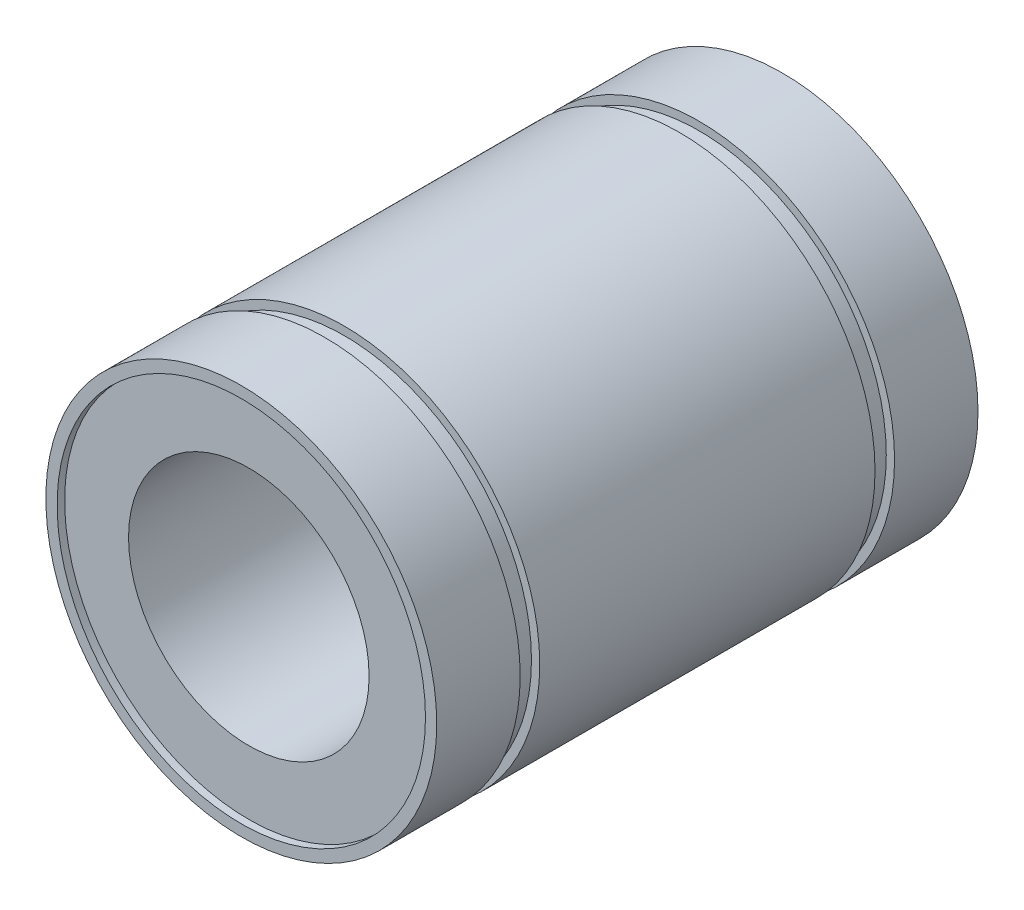
ISO-10303-21;
HEADER;
FILE_DESCRIPTION(('STEP AP214'),'2;1');
FILE_NAME('part.step','',(''),(''),'','','');
FILE_SCHEMA(('AUTOMOTIVE_DESIGN { 1 0 10303 214 1 1 1 1 }'));
ENDSEC;
DATA;
#1=APPLICATION_CONTEXT('core data for automotive mechanical design processes');
#2=APPLICATION_PROTOCOL_DEFINITION('international standard','automotive_design',2000,#1);
#3=PRODUCT_CONTEXT('',#1,'mechanical');
#4=PRODUCT('Part','Part','',(#3));
#5=PRODUCT_RELATED_PRODUCT_CATEGORY('part','',(#4));
#6=PRODUCT_DEFINITION_FORMATION('','',#4);
#7=PRODUCT_DEFINITION_CONTEXT('part definition',#1,'design');
#8=PRODUCT_DEFINITION('design','',#6,#7);
#9=PRODUCT_DEFINITION_SHAPE('','',#8);
#10=(LENGTH_UNIT() NAMED_UNIT(*) SI_UNIT(.MILLI.,.METRE.));
#11=(NAMED_UNIT(*) PLANE_ANGLE_UNIT() SI_UNIT($,.RADIAN.));
#12=(NAMED_UNIT(*) SI_UNIT($,.STERADIAN.) SOLID_ANGLE_UNIT());
#13=UNCERTAINTY_MEASURE_WITH_UNIT(LENGTH_MEASURE(1.E-05),#10,'distance_accuracy_value','');
#14=(GEOMETRIC_REPRESENTATION_CONTEXT(3) GLOBAL_UNCERTAINTY_ASSIGNED_CONTEXT((#13)) GLOBAL_UNIT_ASSIGNED_CONTEXT((#10,
#11,#12)) REPRESENTATION_CONTEXT('',''));
#15=CARTESIAN_POINT('',(0.,0.,0.));
#16=DIRECTION('',(0.,0.,1.));
#17=DIRECTION('',(1.,0.,0.));
#18=AXIS2_PLACEMENT_3D('',#15,#16,#17);
#19=CARTESIAN_POINT('',(0.,0.,18.));
#20=DIRECTION('',(0.,0.,1.));
#21=DIRECTION('',(1.,0.,0.));
#22=AXIS2_PLACEMENT_3D('',#19,#20,#21);
#23=CYLINDRICAL_SURFACE('',#22,8.);
#24=CARTESIAN_POINT('',(0.,0.,35.5));
#25=DIRECTION('',(0.,0.,1.));
#26=DIRECTION('',(1.,0.,0.));
#27=AXIS2_PLACEMENT_3D('',#24,#25,#26);
#28=CIRCLE('',#27,8.);
#29=CARTESIAN_POINT('',(8.,0.,35.5));
#30=VERTEX_POINT('',#29);
#31=EDGE_CURVE('E17',#30,#30,#28,.T.);
#32=ORIENTED_EDGE('',*,*,#31,.T.);
#33=EDGE_LOOP('',(#32));
#34=FACE_BOUND('',#33,.T.);
#35=CARTESIAN_POINT('',(0.,0.,0.5));
#36=DIRECTION('',(0.,0.,1.));
#37=DIRECTION('',(1.,0.,0.));
#38=AXIS2_PLACEMENT_3D('',#35,#36,#37);
#39=CIRCLE('',#38,8.);
#40=CARTESIAN_POINT('',(8.,0.,0.5));
#41=VERTEX_POINT('',#40);
#42=EDGE_CURVE('E63',#41,#41,#39,.T.);
#43=ORIENTED_EDGE('',*,*,#42,.F.);
#44=EDGE_LOOP('',(#43));
#45=FACE_BOUND('',#44,.T.);
#46=ADVANCED_FACE('F14',(#34,#45),#23,.F.);
#47=CARTESIAN_POINT('',(0.,0.,35.5));
#48=DIRECTION('',(0.,0.,-1.));
#49=DIRECTION('',(-1.,0.,0.));
#50=AXIS2_PLACEMENT_3D('',#47,#48,#49);
#51=PLANE('',#50);
#52=ORIENTED_EDGE('',*,*,#31,.F.);
#53=EDGE_LOOP('',(#52));
#54=FACE_BOUND('',#53,.T.);
#55=CARTESIAN_POINT('',(0.,0.,35.5));
#56=DIRECTION('',(0.,0.,1.));
#57=DIRECTION('',(1.,0.,0.));
#58=AXIS2_PLACEMENT_3D('',#55,#56,#57);
#59=CIRCLE('',#58,12.25);
#60=CARTESIAN_POINT('',(12.25,0.,35.5));
#61=VERTEX_POINT('',#60);
#62=EDGE_CURVE('E61',#61,#61,#59,.T.);
#63=ORIENTED_EDGE('',*,*,#62,.T.);
#64=EDGE_LOOP('',(#63));
#65=FACE_BOUND('',#64,.T.);
#66=ADVANCED_FACE('F72',(#54,#65),#51,.F.);
#67=CARTESIAN_POINT('',(0.,0.,0.5));
#68=DIRECTION('',(0.,0.,-1.));
#69=DIRECTION('',(-1.,0.,0.));
#70=AXIS2_PLACEMENT_3D('',#67,#68,#69);
#71=PLANE('',#70);
#72=ORIENTED_EDGE('',*,*,#42,.T.);
#73=EDGE_LOOP('',(#72));
#74=FACE_BOUND('',#73,.T.);
#75=CARTESIAN_POINT('',(0.,0.,0.5));
#76=DIRECTION('',(0.,0.,1.));
#77=DIRECTION('',(1.,0.,0.));
#78=AXIS2_PLACEMENT_3D('',#75,#76,#77);
#79=CIRCLE('',#78,12.25);
#80=CARTESIAN_POINT('',(12.25,0.,0.5));
#81=VERTEX_POINT('',#80);
#82=EDGE_CURVE('E58',#81,#81,#79,.F.);
#83=ORIENTED_EDGE('',*,*,#82,.T.);
#84=EDGE_LOOP('',(#83));
#85=FACE_BOUND('',#84,.T.);
#86=ADVANCED_FACE('F75',(#74,#85),#71,.T.);
#87=CARTESIAN_POINT('',(0.,0.,0.));
#88=DIRECTION('',(0.,0.,1.));
#89=DIRECTION('',(1.,0.,0.));
#90=AXIS2_PLACEMENT_3D('',#87,#88,#89);
#91=CYLINDRICAL_SURFACE('',#90,12.25);
#92=CARTESIAN_POINT('',(0.,0.,36.));
#93=DIRECTION('',(0.,0.,1.));
#94=DIRECTION('',(1.,0.,0.));
#95=AXIS2_PLACEMENT_3D('',#92,#93,#94);
#96=CIRCLE('',#95,12.25);
#97=CARTESIAN_POINT('',(12.25,0.,36.));
#98=VERTEX_POINT('',#97);
#99=EDGE_CURVE('E55',#98,#98,#96,.T.);
#100=ORIENTED_EDGE('',*,*,#99,.T.);
#101=EDGE_LOOP('',(#100));
#102=FACE_BOUND('',#101,.T.);
#103=ORIENTED_EDGE('',*,*,#62,.F.);
#104=EDGE_LOOP('',(#103));
#105=FACE_BOUND('',#104,.T.);
#106=ADVANCED_FACE('F78',(#102,#105),#91,.F.);
#107=CARTESIAN_POINT('',(0.,0.,0.));
#108=DIRECTION('',(0.,0.,1.));
#109=DIRECTION('',(1.,0.,0.));
#110=AXIS2_PLACEMENT_3D('',#107,#108,#109);
#111=CYLINDRICAL_SURFACE('',#110,12.25);
#112=ORIENTED_EDGE('',*,*,#82,.F.);
#113=EDGE_LOOP('',(#112));
#114=FACE_BOUND('',#113,.T.);
#115=CARTESIAN_POINT('',(0.,0.,0.));
#116=DIRECTION('',(0.,0.,1.));
#117=DIRECTION('',(1.,0.,0.));
#118=AXIS2_PLACEMENT_3D('',#115,#116,#117);
#119=CIRCLE('',#118,12.25);
#120=CARTESIAN_POINT('',(12.25,0.,0.));
#121=VERTEX_POINT('',#120);
#122=EDGE_CURVE('E52',#121,#121,#119,.T.);
#123=ORIENTED_EDGE('',*,*,#122,.F.);
#124=EDGE_LOOP('',(#123));
#125=FACE_BOUND('',#124,.T.);
#126=ADVANCED_FACE('F80',(#114,#125),#111,.F.);
#127=CARTESIAN_POINT('',(0.,0.,36.));
#128=DIRECTION('',(0.,0.,-1.));
#129=DIRECTION('',(-1.,0.,0.));
#130=AXIS2_PLACEMENT_3D('',#127,#128,#129);
#131=PLANE('',#130);
#132=ORIENTED_EDGE('',*,*,#99,.F.);
#133=EDGE_LOOP('',(#132));
#134=FACE_BOUND('',#133,.T.);
#135=CARTESIAN_POINT('',(0.,0.,36.));
#136=DIRECTION('',(0.,0.,1.));
#137=DIRECTION('',(1.,0.,0.));
#138=AXIS2_PLACEMENT_3D('',#135,#136,#137);
#139=CIRCLE('',#138,13.);
#140=CARTESIAN_POINT('',(13.,0.,36.));
#141=VERTEX_POINT('',#140);
#142=EDGE_CURVE('E49',#141,#141,#139,.F.);
#143=ORIENTED_EDGE('',*,*,#142,.F.);
#144=EDGE_LOOP('',(#143));
#145=FACE_BOUND('',#144,.T.);
#146=ADVANCED_FACE('F88',(#134,#145),#131,.F.);
#147=CARTESIAN_POINT('',(0.,0.,0.));
#148=DIRECTION('',(0.,0.,-1.));
#149=DIRECTION('',(-1.,0.,0.));
#150=AXIS2_PLACEMENT_3D('',#147,#148,#149);
#151=PLANE('',#150);
#152=ORIENTED_EDGE('',*,*,#122,.T.);
#153=EDGE_LOOP('',(#152));
#154=FACE_BOUND('',#153,.T.);
#155=CARTESIAN_POINT('',(0.,0.,0.));
#156=DIRECTION('',(0.,0.,1.));
#157=DIRECTION('',(1.,0.,0.));
#158=AXIS2_PLACEMENT_3D('',#155,#156,#157);
#159=CIRCLE('',#158,13.);
#160=CARTESIAN_POINT('',(13.,0.,0.));
#161=VERTEX_POINT('',#160);
#162=EDGE_CURVE('E46',#161,#161,#159,.T.);
#163=ORIENTED_EDGE('',*,*,#162,.F.);
#164=EDGE_LOOP('',(#163));
#165=FACE_BOUND('',#164,.T.);
#166=ADVANCED_FACE('F130',(#154,#165),#151,.T.);
#167=CARTESIAN_POINT('',(0.,0.,0.));
#168=DIRECTION('',(0.,0.,1.));
#169=DIRECTION('',(1.,0.,0.));
#170=AXIS2_PLACEMENT_3D('',#167,#168,#169);
#171=CYLINDRICAL_SURFACE('',#170,13.);
#172=CARTESIAN_POINT('',(0.,0.,30.45));
#173=DIRECTION('',(0.,0.,1.));
#174=DIRECTION('',(1.,0.,0.));
#175=AXIS2_PLACEMENT_3D('',#172,#173,#174);
#176=CIRCLE('',#175,13.);
#177=CARTESIAN_POINT('',(13.,0.,30.45));
#178=VERTEX_POINT('',#177);
#179=EDGE_CURVE('E43',#178,#178,#176,.T.);
#180=ORIENTED_EDGE('',*,*,#179,.T.);
#181=EDGE_LOOP('',(#180));
#182=FACE_BOUND('',#181,.T.);
#183=ORIENTED_EDGE('',*,*,#142,.T.);
#184=EDGE_LOOP('',(#183));
#185=FACE_BOUND('',#184,.T.);
#186=ADVANCED_FACE('F126',(#182,#185),#171,.T.);
#187=CARTESIAN_POINT('',(0.,0.,0.));
#188=DIRECTION('',(0.,0.,1.));
#189=DIRECTION('',(1.,0.,0.));
#190=AXIS2_PLACEMENT_3D('',#187,#188,#189);
#191=CYLINDRICAL_SURFACE('',#190,13.);
#192=ORIENTED_EDGE('',*,*,#162,.T.);
#193=EDGE_LOOP('',(#192));
#194=FACE_BOUND('',#193,.T.);
#195=CARTESIAN_POINT('',(0.,0.,5.55));
#196=DIRECTION('',(0.,0.,1.));
#197=DIRECTION('',(1.,0.,0.));
#198=AXIS2_PLACEMENT_3D('',#195,#196,#197);
#199=CIRCLE('',#198,13.);
#200=CARTESIAN_POINT('',(13.,0.,5.55));
#201=VERTEX_POINT('',#200);
#202=EDGE_CURVE('E40',#201,#201,#199,.F.);
#203=ORIENTED_EDGE('',*,*,#202,.T.);
#204=EDGE_LOOP('',(#203));
#205=FACE_BOUND('',#204,.T.);
#206=ADVANCED_FACE('F122',(#194,#205),#191,.T.);
#207=CARTESIAN_POINT('',(12.725,0.,30.45));
#208=DIRECTION('',(0.,0.,1.));
#209=DIRECTION('',(1.,0.,0.));
#210=AXIS2_PLACEMENT_3D('',#207,#208,#209);
#211=PLANE('',#210);
#212=CARTESIAN_POINT('',(0.,0.,30.45));
#213=DIRECTION('',(0.,0.,-1.));
#214=DIRECTION('',(-1.,0.,0.));
#215=AXIS2_PLACEMENT_3D('',#212,#213,#214);
#216=CIRCLE('',#215,12.45);
#217=CARTESIAN_POINT('',(-12.45,0.,30.45));
#218=VERTEX_POINT('',#217);
#219=EDGE_CURVE('E37',#218,#218,#216,.T.);
#220=ORIENTED_EDGE('',*,*,#219,.F.);
#221=EDGE_LOOP('',(#220));
#222=FACE_BOUND('',#221,.T.);
#223=ORIENTED_EDGE('',*,*,#179,.F.);
#224=EDGE_LOOP('',(#223));
#225=FACE_BOUND('',#224,.T.);
#226=ADVANCED_FACE('F118',(#222,#225),#211,.F.);
#227=CARTESIAN_POINT('',(12.725,0.,5.55));
#228=DIRECTION('',(0.,0.,-1.));
#229=DIRECTION('',(-1.,0.,0.));
#230=AXIS2_PLACEMENT_3D('',#227,#228,#229);
#231=PLANE('',#230);
#232=CARTESIAN_POINT('',(0.,0.,5.55));
#233=DIRECTION('',(0.,0.,-1.));
#234=DIRECTION('',(-1.,0.,0.));
#235=AXIS2_PLACEMENT_3D('',#232,#233,#234);
#236=CIRCLE('',#235,12.45);
#237=CARTESIAN_POINT('',(-12.45,0.,5.55));
#238=VERTEX_POINT('',#237);
#239=EDGE_CURVE('E34',#238,#238,#236,.F.);
#240=ORIENTED_EDGE('',*,*,#239,.F.);
#241=EDGE_LOOP('',(#240));
#242=FACE_BOUND('',#241,.T.);
#243=ORIENTED_EDGE('',*,*,#202,.F.);
#244=EDGE_LOOP('',(#243));
#245=FACE_BOUND('',#244,.T.);
#246=ADVANCED_FACE('F114',(#242,#245),#231,.F.);
#247=CARTESIAN_POINT('',(0.,0.,29.8));
#248=DIRECTION('',(0.,0.,-1.));
#249=DIRECTION('',(-1.,0.,0.));
#250=AXIS2_PLACEMENT_3D('',#247,#248,#249);
#251=CYLINDRICAL_SURFACE('',#250,12.45);
#252=CARTESIAN_POINT('',(0.,0.,29.15));
#253=DIRECTION('',(0.,0.,-1.));
#254=DIRECTION('',(-1.,0.,0.));
#255=AXIS2_PLACEMENT_3D('',#252,#253,#254);
#256=CIRCLE('',#255,12.45);
#257=CARTESIAN_POINT('',(-12.45,0.,29.15));
#258=VERTEX_POINT('',#257);
#259=EDGE_CURVE('E31',#258,#258,#256,.F.);
#260=ORIENTED_EDGE('',*,*,#259,.T.);
#261=EDGE_LOOP('',(#260));
#262=FACE_BOUND('',#261,.T.);
#263=ORIENTED_EDGE('',*,*,#219,.T.);
#264=EDGE_LOOP('',(#263));
#265=FACE_BOUND('',#264,.T.);
#266=ADVANCED_FACE('F110',(#262,#265),#251,.T.);
#267=CARTESIAN_POINT('',(0.,0.,6.2));
#268=DIRECTION('',(0.,0.,-1.));
#269=DIRECTION('',(-1.,0.,0.));
#270=AXIS2_PLACEMENT_3D('',#267,#268,#269);
#271=CYLINDRICAL_SURFACE('',#270,12.45);
#272=ORIENTED_EDGE('',*,*,#239,.T.);
#273=EDGE_LOOP('',(#272));
#274=FACE_BOUND('',#273,.T.);
#275=CARTESIAN_POINT('',(0.,0.,6.85));
#276=DIRECTION('',(0.,0.,-1.));
#277=DIRECTION('',(-1.,0.,0.));
#278=AXIS2_PLACEMENT_3D('',#275,#276,#277);
#279=CIRCLE('',#278,12.45);
#280=CARTESIAN_POINT('',(-12.45,0.,6.85));
#281=VERTEX_POINT('',#280);
#282=EDGE_CURVE('E26',#281,#281,#279,.T.);
#283=ORIENTED_EDGE('',*,*,#282,.T.);
#284=EDGE_LOOP('',(#283));
#285=FACE_BOUND('',#284,.T.);
#286=ADVANCED_FACE('F106',(#274,#285),#271,.T.);
#287=CARTESIAN_POINT('',(12.725,0.,29.15));
#288=DIRECTION('',(0.,0.,-1.));
#289=DIRECTION('',(-1.,0.,0.));
#290=AXIS2_PLACEMENT_3D('',#287,#288,#289);
#291=PLANE('',#290);
#292=ORIENTED_EDGE('',*,*,#259,.F.);
#293=EDGE_LOOP('',(#292));
#294=FACE_BOUND('',#293,.T.);
#295=CARTESIAN_POINT('',(0.,0.,29.15));
#296=DIRECTION('',(0.,0.,1.));
#297=DIRECTION('',(1.,0.,0.));
#298=AXIS2_PLACEMENT_3D('',#295,#296,#297);
#299=CIRCLE('',#298,13.);
#300=CARTESIAN_POINT('',(13.,0.,29.15));
#301=VERTEX_POINT('',#300);
#302=EDGE_CURVE('E21',#301,#301,#299,.F.);
#303=ORIENTED_EDGE('',*,*,#302,.F.);
#304=EDGE_LOOP('',(#303));
#305=FACE_BOUND('',#304,.T.);
#306=ADVANCED_FACE('F99',(#294,#305),#291,.F.);
#307=CARTESIAN_POINT('',(12.725,0.,6.85));
#308=DIRECTION('',(0.,0.,1.));
#309=DIRECTION('',(1.,0.,0.));
#310=AXIS2_PLACEMENT_3D('',#307,#308,#309);
#311=PLANE('',#310);
#312=ORIENTED_EDGE('',*,*,#282,.F.);
#313=EDGE_LOOP('',(#312));
#314=FACE_BOUND('',#313,.T.);
#315=CARTESIAN_POINT('',(0.,0.,6.85));
#316=DIRECTION('',(0.,0.,1.));
#317=DIRECTION('',(1.,0.,0.));
#318=AXIS2_PLACEMENT_3D('',#315,#316,#317);
#319=CIRCLE('',#318,13.);
#320=CARTESIAN_POINT('',(13.,0.,6.85));
#321=VERTEX_POINT('',#320);
#322=EDGE_CURVE('E9',#321,#321,#319,.T.);
#323=ORIENTED_EDGE('',*,*,#322,.F.);
#324=EDGE_LOOP('',(#323));
#325=FACE_BOUND('',#324,.T.);
#326=ADVANCED_FACE('F94',(#314,#325),#311,.F.);
#327=CARTESIAN_POINT('',(0.,0.,0.));
#328=DIRECTION('',(0.,0.,1.));
#329=DIRECTION('',(1.,0.,0.));
#330=AXIS2_PLACEMENT_3D('',#327,#328,#329);
#331=CYLINDRICAL_SURFACE('',#330,13.);
#332=ORIENTED_EDGE('',*,*,#322,.T.);
#333=EDGE_LOOP('',(#332));
#334=FACE_BOUND('',#333,.T.);
#335=ORIENTED_EDGE('',*,*,#302,.T.);
#336=EDGE_LOOP('',(#335));
#337=FACE_BOUND('',#336,.T.);
#338=ADVANCED_FACE('F92',(#334,#337),#331,.T.);
#339=CLOSED_SHELL('',(#46,#66,#86,#106,#126,#146,#166,#186,#206,#226,#246,#266,#286,#306,#326,#338));
#340=MANIFOLD_SOLID_BREP('B1',#339);
#341=ADVANCED_BREP_SHAPE_REPRESENTATION('',(#18,#340),#14);
#342=SHAPE_DEFINITION_REPRESENTATION(#9,#341);
ENDSEC;
END-ISO-10303-21;
